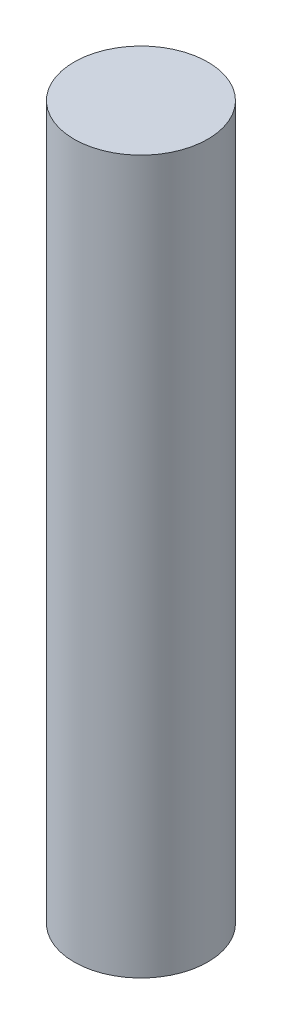
ISO-10303-21;
HEADER;
FILE_DESCRIPTION(('STEP AP214'),'2;1');
FILE_NAME('part.step','',(''),(''),'','','');
FILE_SCHEMA(('AUTOMOTIVE_DESIGN { 1 0 10303 214 1 1 1 1 }'));
ENDSEC;
DATA;
#1=APPLICATION_CONTEXT('core data for automotive mechanical design processes');
#2=APPLICATION_PROTOCOL_DEFINITION('international standard','automotive_design',2000,#1);
#3=PRODUCT_CONTEXT('',#1,'mechanical');
#4=PRODUCT('Part','Part','',(#3));
#5=PRODUCT_RELATED_PRODUCT_CATEGORY('part','',(#4));
#6=PRODUCT_DEFINITION_FORMATION('','',#4);
#7=PRODUCT_DEFINITION_CONTEXT('part definition',#1,'design');
#8=PRODUCT_DEFINITION('design','',#6,#7);
#9=PRODUCT_DEFINITION_SHAPE('','',#8);
#10=(LENGTH_UNIT() NAMED_UNIT(*) SI_UNIT(.MILLI.,.METRE.));
#11=(NAMED_UNIT(*) PLANE_ANGLE_UNIT() SI_UNIT($,.RADIAN.));
#12=(NAMED_UNIT(*) SI_UNIT($,.STERADIAN.) SOLID_ANGLE_UNIT());
#13=UNCERTAINTY_MEASURE_WITH_UNIT(LENGTH_MEASURE(1.E-05),#10,'distance_accuracy_value','');
#14=(GEOMETRIC_REPRESENTATION_CONTEXT(3) GLOBAL_UNCERTAINTY_ASSIGNED_CONTEXT((#13)) GLOBAL_UNIT_ASSIGNED_CONTEXT((#10,
#11,#12)) REPRESENTATION_CONTEXT('',''));
#15=CARTESIAN_POINT('',(0.,0.,0.));
#16=DIRECTION('',(0.,0.,1.));
#17=DIRECTION('',(1.,0.,0.));
#18=AXIS2_PLACEMENT_3D('',#15,#16,#17);
#19=CARTESIAN_POINT('',(0.,50.,0.));
#20=DIRECTION('',(0.,-1.,0.));
#21=DIRECTION('',(0.,0.,-1.));
#22=AXIS2_PLACEMENT_3D('',#19,#20,#21);
#23=CYLINDRICAL_SURFACE('',#22,4.6913409606293);
#24=CARTESIAN_POINT('',(0.,50.,0.));
#25=DIRECTION('',(0.,1.,0.));
#26=DIRECTION('',(0.,0.,1.));
#27=AXIS2_PLACEMENT_3D('',#24,#25,#26);
#28=CIRCLE('',#27,4.6913409606293);
#29=CARTESIAN_POINT('',(0.,50.,4.6913409606293));
#30=VERTEX_POINT('',#29);
#31=EDGE_CURVE('E10',#30,#30,#28,.T.);
#32=ORIENTED_EDGE('',*,*,#31,.F.);
#33=EDGE_LOOP('',(#32));
#34=FACE_BOUND('',#33,.T.);
#35=CARTESIAN_POINT('',(0.,0.,0.));
#36=DIRECTION('',(0.,1.,0.));
#37=DIRECTION('',(0.,0.,1.));
#38=AXIS2_PLACEMENT_3D('',#35,#36,#37);
#39=CIRCLE('',#38,4.6913409606293);
#40=CARTESIAN_POINT('',(0.,0.,4.6913409606293));
#41=VERTEX_POINT('',#40);
#42=EDGE_CURVE('E34',#41,#41,#39,.T.);
#43=ORIENTED_EDGE('',*,*,#42,.T.);
#44=EDGE_LOOP('',(#43));
#45=FACE_BOUND('',#44,.T.);
#46=ADVANCED_FACE('F31',(#34,#45),#23,.T.);
#47=CARTESIAN_POINT('',(0.,50.,0.));
#48=DIRECTION('',(0.,1.,0.));
#49=DIRECTION('',(0.,0.,1.));
#50=AXIS2_PLACEMENT_3D('',#47,#48,#49);
#51=PLANE('',#50);
#52=ORIENTED_EDGE('',*,*,#31,.T.);
#53=EDGE_LOOP('',(#52));
#54=FACE_BOUND('',#53,.T.);
#55=ADVANCED_FACE('F46',(#54),#51,.T.);
#56=CARTESIAN_POINT('',(0.,0.,0.));
#57=DIRECTION('',(0.,1.,0.));
#58=DIRECTION('',(0.,0.,1.));
#59=AXIS2_PLACEMENT_3D('',#56,#57,#58);
#60=PLANE('',#59);
#61=ORIENTED_EDGE('',*,*,#42,.F.);
#62=EDGE_LOOP('',(#61));
#63=FACE_BOUND('',#62,.T.);
#64=ADVANCED_FACE('F44',(#63),#60,.F.);
#65=CLOSED_SHELL('',(#46,#55,#64));
#66=MANIFOLD_SOLID_BREP('B2',#65);
#67=ADVANCED_BREP_SHAPE_REPRESENTATION('',(#18,#66),#14);
#68=SHAPE_DEFINITION_REPRESENTATION(#9,#67);
ENDSEC;
END-ISO-10303-21;
